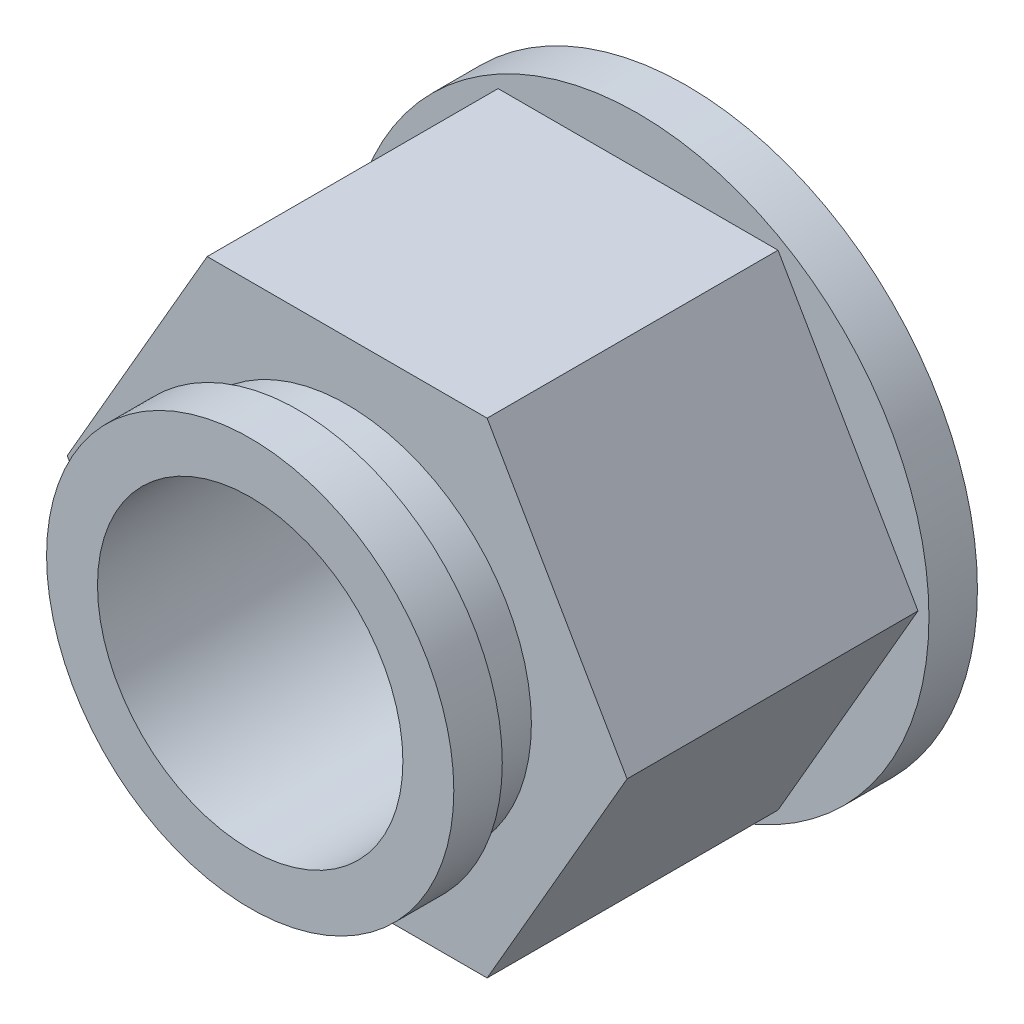
ISO-10303-21;
HEADER;
FILE_DESCRIPTION(('STEP AP214'),'2;1');
FILE_NAME('part.step','',(''),(''),'','','');
FILE_SCHEMA(('AUTOMOTIVE_DESIGN { 1 0 10303 214 1 1 1 1 }'));
ENDSEC;
DATA;
#1=APPLICATION_CONTEXT('core data for automotive mechanical design processes');
#2=APPLICATION_PROTOCOL_DEFINITION('international standard','automotive_design',2000,#1);
#3=PRODUCT_CONTEXT('',#1,'mechanical');
#4=PRODUCT('Part','Part','',(#3));
#5=PRODUCT_RELATED_PRODUCT_CATEGORY('part','',(#4));
#6=PRODUCT_DEFINITION_FORMATION('','',#4);
#7=PRODUCT_DEFINITION_CONTEXT('part definition',#1,'design');
#8=PRODUCT_DEFINITION('design','',#6,#7);
#9=PRODUCT_DEFINITION_SHAPE('','',#8);
#10=(LENGTH_UNIT() NAMED_UNIT(*) SI_UNIT(.MILLI.,.METRE.));
#11=(NAMED_UNIT(*) PLANE_ANGLE_UNIT() SI_UNIT($,.RADIAN.));
#12=(NAMED_UNIT(*) SI_UNIT($,.STERADIAN.) SOLID_ANGLE_UNIT());
#13=UNCERTAINTY_MEASURE_WITH_UNIT(LENGTH_MEASURE(1.E-05),#10,'distance_accuracy_value','');
#14=(GEOMETRIC_REPRESENTATION_CONTEXT(3) GLOBAL_UNCERTAINTY_ASSIGNED_CONTEXT((#13)) GLOBAL_UNIT_ASSIGNED_CONTEXT((#10,
#11,#12)) REPRESENTATION_CONTEXT('',''));
#15=CARTESIAN_POINT('',(0.,0.,0.));
#16=DIRECTION('',(0.,0.,1.));
#17=DIRECTION('',(1.,0.,0.));
#18=AXIS2_PLACEMENT_3D('',#15,#16,#17);
#19=CARTESIAN_POINT('',(3.6661742093542,-6.34999999999996,3.81));
#20=DIRECTION('',(-0.866025403784442,0.499999999999995,0.));
#21=DIRECTION('',(-0.499999999999995,-0.866025403784442,0.));
#22=AXIS2_PLACEMENT_3D('',#19,#20,#21);
#23=PLANE('',#22);
#24=DIRECTION('',(0.499999999999995,0.866025403784441,0.));
#25=VECTOR('',#24,1.);
#26=CARTESIAN_POINT('',(3.6661742093542,-6.34999999999996,-3.81));
#27=LINE('',#26,#25);
#28=CARTESIAN_POINT('',(3.6661742093542,-6.34999999999996,-3.81));
#29=VERTEX_POINT('',#28);
#30=CARTESIAN_POINT('',(7.33234841870825,0.,-3.81));
#31=VERTEX_POINT('',#30);
#32=EDGE_CURVE('E87',#29,#31,#27,.T.);
#33=ORIENTED_EDGE('',*,*,#32,.T.);
#34=DIRECTION('',(0.,0.,-1.));
#35=VECTOR('',#34,1.);
#36=CARTESIAN_POINT('',(7.33234841870825,0.,3.81));
#37=LINE('',#36,#35);
#38=CARTESIAN_POINT('',(7.33234841870825,0.,3.81));
#39=VERTEX_POINT('',#38);
#40=EDGE_CURVE('E11',#39,#31,#37,.T.);
#41=ORIENTED_EDGE('',*,*,#40,.F.);
#42=DIRECTION('',(0.499999999999995,0.866025403784441,0.));
#43=VECTOR('',#42,1.);
#44=CARTESIAN_POINT('',(3.6661742093542,-6.34999999999996,3.81));
#45=LINE('',#44,#43);
#46=CARTESIAN_POINT('',(3.6661742093542,-6.34999999999996,3.81));
#47=VERTEX_POINT('',#46);
#48=EDGE_CURVE('E91',#47,#39,#45,.T.);
#49=ORIENTED_EDGE('',*,*,#48,.F.);
#50=DIRECTION('',(0.,0.,-1.));
#51=VECTOR('',#50,1.);
#52=CARTESIAN_POINT('',(3.6661742093542,-6.34999999999996,3.81));
#53=LINE('',#52,#51);
#54=EDGE_CURVE('E104',#47,#29,#53,.T.);
#55=ORIENTED_EDGE('',*,*,#54,.T.);
#56=EDGE_LOOP('',(#33,#41,#49,#55));
#57=FACE_BOUND('',#56,.T.);
#58=ADVANCED_FACE('F33',(#57),#23,.F.);
#59=CARTESIAN_POINT('',(7.33234841870825,0.,3.81));
#60=DIRECTION('',(-0.866025403784438,-0.500000000000001,0.));
#61=DIRECTION('',(0.500000000000001,-0.866025403784438,0.));
#62=AXIS2_PLACEMENT_3D('',#59,#60,#61);
#63=PLANE('',#62);
#64=DIRECTION('',(-0.500000000000001,0.866025403784438,0.));
#65=VECTOR('',#64,1.);
#66=CARTESIAN_POINT('',(7.33234841870825,0.,-3.81));
#67=LINE('',#66,#65);
#68=CARTESIAN_POINT('',(3.66617420935411,6.35000000000001,-3.81));
#69=VERTEX_POINT('',#68);
#70=EDGE_CURVE('E124',#31,#69,#67,.T.);
#71=ORIENTED_EDGE('',*,*,#70,.T.);
#72=DIRECTION('',(0.,0.,-1.));
#73=VECTOR('',#72,1.);
#74=CARTESIAN_POINT('',(3.66617420935411,6.35000000000001,3.81));
#75=LINE('',#74,#73);
#76=CARTESIAN_POINT('',(3.66617420935411,6.35000000000001,3.81));
#77=VERTEX_POINT('',#76);
#78=EDGE_CURVE('E41',#77,#69,#75,.T.);
#79=ORIENTED_EDGE('',*,*,#78,.F.);
#80=DIRECTION('',(-0.500000000000001,0.866025403784438,0.));
#81=VECTOR('',#80,1.);
#82=CARTESIAN_POINT('',(7.33234841870825,0.,3.81));
#83=LINE('',#82,#81);
#84=EDGE_CURVE('E123',#39,#77,#83,.T.);
#85=ORIENTED_EDGE('',*,*,#84,.F.);
#86=ORIENTED_EDGE('',*,*,#40,.T.);
#87=EDGE_LOOP('',(#71,#79,#85,#86));
#88=FACE_BOUND('',#87,.T.);
#89=ADVANCED_FACE('F122',(#88),#63,.F.);
#90=CARTESIAN_POINT('',(3.66617420935411,6.35000000000001,3.81));
#91=DIRECTION('',(0.,-1.,0.));
#92=DIRECTION('',(1.,0.,0.));
#93=AXIS2_PLACEMENT_3D('',#90,#91,#92);
#94=PLANE('',#93);
#95=DIRECTION('',(-1.,0.,0.));
#96=VECTOR('',#95,1.);
#97=CARTESIAN_POINT('',(3.66617420935411,6.35000000000001,-3.81));
#98=LINE('',#97,#96);
#99=CARTESIAN_POINT('',(-3.66617420935416,6.34999999999999,-3.81));
#100=VERTEX_POINT('',#99);
#101=EDGE_CURVE('E118',#69,#100,#98,.T.);
#102=ORIENTED_EDGE('',*,*,#101,.T.);
#103=DIRECTION('',(0.,0.,-1.));
#104=VECTOR('',#103,1.);
#105=CARTESIAN_POINT('',(-3.66617420935416,6.34999999999999,3.81));
#106=LINE('',#105,#104);
#107=CARTESIAN_POINT('',(-3.66617420935416,6.34999999999999,3.81));
#108=VERTEX_POINT('',#107);
#109=EDGE_CURVE('E106',#108,#100,#106,.T.);
#110=ORIENTED_EDGE('',*,*,#109,.F.);
#111=DIRECTION('',(-1.,0.,0.));
#112=VECTOR('',#111,1.);
#113=CARTESIAN_POINT('',(3.66617420935411,6.35000000000001,3.81));
#114=LINE('',#113,#112);
#115=EDGE_CURVE('E119',#77,#108,#114,.T.);
#116=ORIENTED_EDGE('',*,*,#115,.F.);
#117=ORIENTED_EDGE('',*,*,#78,.T.);
#118=EDGE_LOOP('',(#102,#110,#116,#117));
#119=FACE_BOUND('',#118,.T.);
#120=ADVANCED_FACE('F116',(#119),#94,.F.);
#121=CARTESIAN_POINT('',(-3.66617420935416,6.34999999999999,3.81));
#122=DIRECTION('',(0.866025403784442,-0.499999999999995,0.));
#123=DIRECTION('',(0.499999999999995,0.866025403784442,0.));
#124=AXIS2_PLACEMENT_3D('',#121,#122,#123);
#125=PLANE('',#124);
#126=DIRECTION('',(-0.499999999999995,-0.866025403784441,0.));
#127=VECTOR('',#126,1.);
#128=CARTESIAN_POINT('',(-3.66617420935416,6.34999999999999,-3.81));
#129=LINE('',#128,#127);
#130=CARTESIAN_POINT('',(-7.33234841870825,0.,-3.81));
#131=VERTEX_POINT('',#130);
#132=EDGE_CURVE('E101',#100,#131,#129,.T.);
#133=ORIENTED_EDGE('',*,*,#132,.T.);
#134=DIRECTION('',(0.,0.,-1.));
#135=VECTOR('',#134,1.);
#136=CARTESIAN_POINT('',(-7.33234841870825,0.,3.81));
#137=LINE('',#136,#135);
#138=CARTESIAN_POINT('',(-7.33234841870825,0.,3.81));
#139=VERTEX_POINT('',#138);
#140=EDGE_CURVE('E100',#139,#131,#137,.T.);
#141=ORIENTED_EDGE('',*,*,#140,.F.);
#142=DIRECTION('',(-0.499999999999995,-0.866025403784441,0.));
#143=VECTOR('',#142,1.);
#144=CARTESIAN_POINT('',(-3.66617420935416,6.34999999999999,3.81));
#145=LINE('',#144,#143);
#146=EDGE_CURVE('E135',#108,#139,#145,.T.);
#147=ORIENTED_EDGE('',*,*,#146,.F.);
#148=ORIENTED_EDGE('',*,*,#109,.T.);
#149=EDGE_LOOP('',(#133,#141,#147,#148));
#150=FACE_BOUND('',#149,.T.);
#151=ADVANCED_FACE('F133',(#150),#125,.F.);
#152=CARTESIAN_POINT('',(-7.33234841870825,0.,3.81));
#153=DIRECTION('',(0.866025403784434,0.500000000000007,0.));
#154=DIRECTION('',(-0.500000000000007,0.866025403784435,0.));
#155=AXIS2_PLACEMENT_3D('',#152,#153,#154);
#156=PLANE('',#155);
#157=DIRECTION('',(0.500000000000007,-0.866025403784435,0.));
#158=VECTOR('',#157,1.);
#159=CARTESIAN_POINT('',(-7.33234841870825,0.,-3.81));
#160=LINE('',#159,#158);
#161=CARTESIAN_POINT('',(-3.66617420935407,-6.35000000000004,-3.81));
#162=VERTEX_POINT('',#161);
#163=EDGE_CURVE('E84',#131,#162,#160,.T.);
#164=ORIENTED_EDGE('',*,*,#163,.T.);
#165=DIRECTION('',(0.,0.,-1.));
#166=VECTOR('',#165,1.);
#167=CARTESIAN_POINT('',(-3.66617420935407,-6.35000000000004,3.81));
#168=LINE('',#167,#166);
#169=CARTESIAN_POINT('',(-3.66617420935407,-6.35000000000004,3.81));
#170=VERTEX_POINT('',#169);
#171=EDGE_CURVE('E98',#170,#162,#168,.T.);
#172=ORIENTED_EDGE('',*,*,#171,.F.);
#173=DIRECTION('',(0.500000000000007,-0.866025403784435,0.));
#174=VECTOR('',#173,1.);
#175=CARTESIAN_POINT('',(-7.33234841870825,0.,3.81));
#176=LINE('',#175,#174);
#177=EDGE_CURVE('E136',#139,#170,#176,.T.);
#178=ORIENTED_EDGE('',*,*,#177,.F.);
#179=ORIENTED_EDGE('',*,*,#140,.T.);
#180=EDGE_LOOP('',(#164,#172,#178,#179));
#181=FACE_BOUND('',#180,.T.);
#182=ADVANCED_FACE('F96',(#181),#156,.F.);
#183=CARTESIAN_POINT('',(-3.66617420935407,-6.35000000000004,3.81));
#184=DIRECTION('',(0.,1.,0.));
#185=DIRECTION('',(-1.,0.,0.));
#186=AXIS2_PLACEMENT_3D('',#183,#184,#185);
#187=PLANE('',#186);
#188=DIRECTION('',(1.,0.,0.));
#189=VECTOR('',#188,1.);
#190=CARTESIAN_POINT('',(-3.66617420935407,-6.35000000000004,-3.81));
#191=LINE('',#190,#189);
#192=EDGE_CURVE('E81',#162,#29,#191,.T.);
#193=ORIENTED_EDGE('',*,*,#192,.T.);
#194=ORIENTED_EDGE('',*,*,#54,.F.);
#195=DIRECTION('',(1.,0.,0.));
#196=VECTOR('',#195,1.);
#197=CARTESIAN_POINT('',(-3.66617420935407,-6.35000000000004,3.81));
#198=LINE('',#197,#196);
#199=EDGE_CURVE('E48',#170,#47,#198,.T.);
#200=ORIENTED_EDGE('',*,*,#199,.F.);
#201=ORIENTED_EDGE('',*,*,#171,.T.);
#202=EDGE_LOOP('',(#193,#194,#200,#201));
#203=FACE_BOUND('',#202,.T.);
#204=ADVANCED_FACE('F103',(#203),#187,.F.);
#205=CARTESIAN_POINT('',(0.,0.,3.81));
#206=DIRECTION('',(0.,0.,1.));
#207=DIRECTION('',(1.,0.,0.));
#208=AXIS2_PLACEMENT_3D('',#205,#206,#207);
#209=PLANE('',#208);
#210=CARTESIAN_POINT('',(0.,0.,3.81));
#211=DIRECTION('',(0.,0.,1.));
#212=DIRECTION('',(1.,0.,0.));
#213=AXIS2_PLACEMENT_3D('',#210,#211,#212);
#214=CIRCLE('',#213,4.826);
#215=CARTESIAN_POINT('',(4.826,0.,3.81));
#216=VERTEX_POINT('',#215);
#217=EDGE_CURVE('E149',#216,#216,#214,.T.);
#218=ORIENTED_EDGE('',*,*,#217,.F.);
#219=EDGE_LOOP('',(#218));
#220=FACE_BOUND('',#219,.T.);
#221=ORIENTED_EDGE('',*,*,#48,.T.);
#222=ORIENTED_EDGE('',*,*,#84,.T.);
#223=ORIENTED_EDGE('',*,*,#115,.T.);
#224=ORIENTED_EDGE('',*,*,#146,.T.);
#225=ORIENTED_EDGE('',*,*,#177,.T.);
#226=ORIENTED_EDGE('',*,*,#199,.T.);
#227=EDGE_LOOP('',(#221,#222,#223,#224,#225,#226));
#228=FACE_BOUND('',#227,.T.);
#229=ADVANCED_FACE('F191',(#220,#228),#209,.T.);
#230=CARTESIAN_POINT('',(0.,0.,-3.81));
#231=DIRECTION('',(0.,0.,-1.));
#232=DIRECTION('',(-1.,0.,0.));
#233=AXIS2_PLACEMENT_3D('',#230,#231,#232);
#234=PLANE('',#233);
#235=CARTESIAN_POINT('',(0.,0.,-3.81));
#236=DIRECTION('',(0.,0.,-1.));
#237=DIRECTION('',(-1.,0.,0.));
#238=AXIS2_PLACEMENT_3D('',#235,#236,#237);
#239=CIRCLE('',#238,7.62);
#240=CARTESIAN_POINT('',(-7.62,0.,-3.81));
#241=VERTEX_POINT('',#240);
#242=EDGE_CURVE('E143',#241,#241,#239,.T.);
#243=ORIENTED_EDGE('',*,*,#242,.F.);
#244=EDGE_LOOP('',(#243));
#245=FACE_BOUND('',#244,.T.);
#246=ORIENTED_EDGE('',*,*,#70,.F.);
#247=ORIENTED_EDGE('',*,*,#32,.F.);
#248=ORIENTED_EDGE('',*,*,#192,.F.);
#249=ORIENTED_EDGE('',*,*,#163,.F.);
#250=ORIENTED_EDGE('',*,*,#132,.F.);
#251=ORIENTED_EDGE('',*,*,#101,.F.);
#252=EDGE_LOOP('',(#246,#247,#248,#249,#250,#251));
#253=FACE_BOUND('',#252,.T.);
#254=ADVANCED_FACE('F83',(#245,#253),#234,.F.);
#255=CARTESIAN_POINT('',(0.,0.,-5.08));
#256=DIRECTION('',(0.,0.,1.));
#257=DIRECTION('',(1.,0.,0.));
#258=AXIS2_PLACEMENT_3D('',#255,#256,#257);
#259=CYLINDRICAL_SURFACE('',#258,7.62);
#260=CARTESIAN_POINT('',(0.,0.,-5.08));
#261=DIRECTION('',(0.,0.,-1.));
#262=DIRECTION('',(-1.,0.,0.));
#263=AXIS2_PLACEMENT_3D('',#260,#261,#262);
#264=CIRCLE('',#263,7.62);
#265=CARTESIAN_POINT('',(-7.62,0.,-5.08));
#266=VERTEX_POINT('',#265);
#267=EDGE_CURVE('E128',#266,#266,#264,.T.);
#268=ORIENTED_EDGE('',*,*,#267,.F.);
#269=EDGE_LOOP('',(#268));
#270=FACE_BOUND('',#269,.T.);
#271=ORIENTED_EDGE('',*,*,#242,.T.);
#272=EDGE_LOOP('',(#271));
#273=FACE_BOUND('',#272,.T.);
#274=ADVANCED_FACE('F181',(#270,#273),#259,.T.);
#275=CARTESIAN_POINT('',(0.,0.,-5.08));
#276=DIRECTION('',(0.,0.,-1.));
#277=DIRECTION('',(-1.,0.,0.));
#278=AXIS2_PLACEMENT_3D('',#275,#276,#277);
#279=PLANE('',#278);
#280=CARTESIAN_POINT('',(0.,0.,-5.08));
#281=DIRECTION('',(0.,0.,-1.));
#282=DIRECTION('',(-1.,0.,0.));
#283=AXIS2_PLACEMENT_3D('',#280,#281,#282);
#284=CIRCLE('',#283,4.);
#285=CARTESIAN_POINT('',(-4.,0.,-5.08));
#286=VERTEX_POINT('',#285);
#287=EDGE_CURVE('E161',#286,#286,#284,.T.);
#288=ORIENTED_EDGE('',*,*,#287,.F.);
#289=EDGE_LOOP('',(#288));
#290=FACE_BOUND('',#289,.T.);
#291=ORIENTED_EDGE('',*,*,#267,.T.);
#292=EDGE_LOOP('',(#291));
#293=FACE_BOUND('',#292,.T.);
#294=ADVANCED_FACE('F177',(#290,#293),#279,.T.);
#295=CARTESIAN_POINT('',(0.,0.,5.08));
#296=DIRECTION('',(0.,0.,-1.));
#297=DIRECTION('',(-1.,0.,0.));
#298=AXIS2_PLACEMENT_3D('',#295,#296,#297);
#299=CYLINDRICAL_SURFACE('',#298,4.826);
#300=CARTESIAN_POINT('',(0.,0.,5.08));
#301=DIRECTION('',(0.,0.,1.));
#302=DIRECTION('',(1.,0.,0.));
#303=AXIS2_PLACEMENT_3D('',#300,#301,#302);
#304=CIRCLE('',#303,4.826);
#305=CARTESIAN_POINT('',(4.826,0.,5.08));
#306=VERTEX_POINT('',#305);
#307=EDGE_CURVE('E146',#306,#306,#304,.T.);
#308=ORIENTED_EDGE('',*,*,#307,.F.);
#309=EDGE_LOOP('',(#308));
#310=FACE_BOUND('',#309,.T.);
#311=ORIENTED_EDGE('',*,*,#217,.T.);
#312=EDGE_LOOP('',(#311));
#313=FACE_BOUND('',#312,.T.);
#314=ADVANCED_FACE('F180',(#310,#313),#299,.T.);
#315=CARTESIAN_POINT('',(0.,0.,6.35));
#316=DIRECTION('',(0.,0.,-1.));
#317=DIRECTION('',(-1.,0.,0.));
#318=AXIS2_PLACEMENT_3D('',#315,#316,#317);
#319=CYLINDRICAL_SURFACE('',#318,5.334);
#320=CARTESIAN_POINT('',(0.,0.,6.35));
#321=DIRECTION('',(0.,0.,1.));
#322=DIRECTION('',(1.,0.,0.));
#323=AXIS2_PLACEMENT_3D('',#320,#321,#322);
#324=CIRCLE('',#323,5.334);
#325=CARTESIAN_POINT('',(5.334,0.,6.35));
#326=VERTEX_POINT('',#325);
#327=EDGE_CURVE('E152',#326,#326,#324,.T.);
#328=ORIENTED_EDGE('',*,*,#327,.F.);
#329=EDGE_LOOP('',(#328));
#330=FACE_BOUND('',#329,.T.);
#331=CARTESIAN_POINT('',(0.,0.,5.08));
#332=DIRECTION('',(0.,0.,1.));
#333=DIRECTION('',(1.,0.,0.));
#334=AXIS2_PLACEMENT_3D('',#331,#332,#333);
#335=CIRCLE('',#334,5.334);
#336=CARTESIAN_POINT('',(5.334,0.,5.08));
#337=VERTEX_POINT('',#336);
#338=EDGE_CURVE('E155',#337,#337,#335,.T.);
#339=ORIENTED_EDGE('',*,*,#338,.T.);
#340=EDGE_LOOP('',(#339));
#341=FACE_BOUND('',#340,.T.);
#342=ADVANCED_FACE('F235',(#330,#341),#319,.T.);
#343=CARTESIAN_POINT('',(0.,0.,6.35));
#344=DIRECTION('',(0.,0.,1.));
#345=DIRECTION('',(1.,0.,0.));
#346=AXIS2_PLACEMENT_3D('',#343,#344,#345);
#347=PLANE('',#346);
#348=CARTESIAN_POINT('',(0.,0.,6.35));
#349=DIRECTION('',(0.,0.,-1.));
#350=DIRECTION('',(-1.,0.,0.));
#351=AXIS2_PLACEMENT_3D('',#348,#349,#350);
#352=CIRCLE('',#351,4.);
#353=CARTESIAN_POINT('',(-4.,0.,6.35));
#354=VERTEX_POINT('',#353);
#355=EDGE_CURVE('E158',#354,#354,#352,.T.);
#356=ORIENTED_EDGE('',*,*,#355,.T.);
#357=EDGE_LOOP('',(#356));
#358=FACE_BOUND('',#357,.T.);
#359=ORIENTED_EDGE('',*,*,#327,.T.);
#360=EDGE_LOOP('',(#359));
#361=FACE_BOUND('',#360,.T.);
#362=ADVANCED_FACE('F167',(#358,#361),#347,.T.);
#363=CARTESIAN_POINT('',(0.,0.,5.08));
#364=DIRECTION('',(0.,0.,1.));
#365=DIRECTION('',(1.,0.,0.));
#366=AXIS2_PLACEMENT_3D('',#363,#364,#365);
#367=PLANE('',#366);
#368=ORIENTED_EDGE('',*,*,#307,.T.);
#369=EDGE_LOOP('',(#368));
#370=FACE_BOUND('',#369,.T.);
#371=ORIENTED_EDGE('',*,*,#338,.F.);
#372=EDGE_LOOP('',(#371));
#373=FACE_BOUND('',#372,.T.);
#374=ADVANCED_FACE('F173',(#370,#373),#367,.F.);
#375=CARTESIAN_POINT('',(0.,0.,6.35));
#376=DIRECTION('',(0.,0.,-1.));
#377=DIRECTION('',(-1.,0.,0.));
#378=AXIS2_PLACEMENT_3D('',#375,#376,#377);
#379=CYLINDRICAL_SURFACE('',#378,4.);
#380=ORIENTED_EDGE('',*,*,#355,.F.);
#381=EDGE_LOOP('',(#380));
#382=FACE_BOUND('',#381,.T.);
#383=ORIENTED_EDGE('',*,*,#287,.T.);
#384=EDGE_LOOP('',(#383));
#385=FACE_BOUND('',#384,.T.);
#386=ADVANCED_FACE('F170',(#382,#385),#379,.F.);
#387=CLOSED_SHELL('',(#58,#89,#120,#151,#182,#204,#229,#254,#274,#294,#314,#342,#362,#374,#386));
#388=MANIFOLD_SOLID_BREP('B2',#387);
#389=ADVANCED_BREP_SHAPE_REPRESENTATION('',(#18,#388),#14);
#390=SHAPE_DEFINITION_REPRESENTATION(#9,#389);
ENDSEC;
END-ISO-10303-21;
